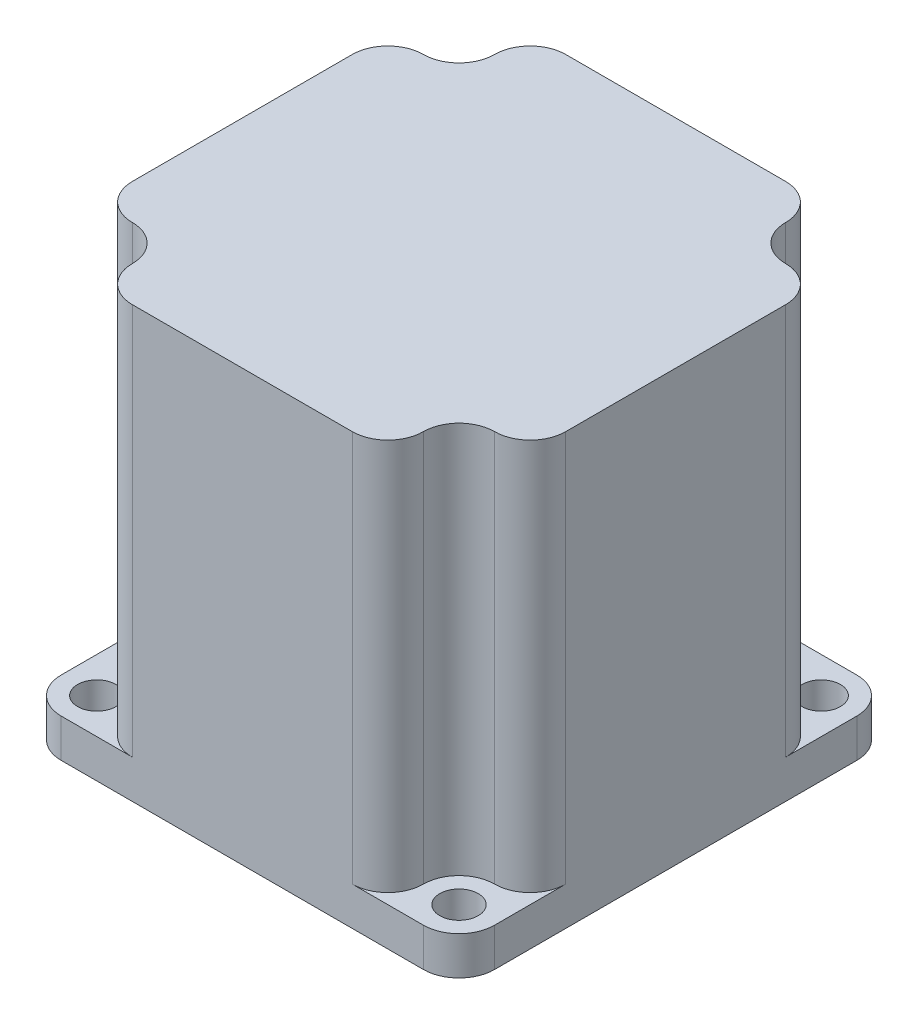
ISO-10303-21;
HEADER;
FILE_DESCRIPTION(('STEP AP214'),'2;1');
FILE_NAME('part.step','',(''),(''),'','','');
FILE_SCHEMA(('AUTOMOTIVE_DESIGN { 1 0 10303 214 1 1 1 1 }'));
ENDSEC;
DATA;
#1=APPLICATION_CONTEXT('core data for automotive mechanical design processes');
#2=APPLICATION_PROTOCOL_DEFINITION('international standard','automotive_design',2000,#1);
#3=PRODUCT_CONTEXT('',#1,'mechanical');
#4=PRODUCT('Part','Part','',(#3));
#5=PRODUCT_RELATED_PRODUCT_CATEGORY('part','',(#4));
#6=PRODUCT_DEFINITION_FORMATION('','',#4);
#7=PRODUCT_DEFINITION_CONTEXT('part definition',#1,'design');
#8=PRODUCT_DEFINITION('design','',#6,#7);
#9=PRODUCT_DEFINITION_SHAPE('','',#8);
#10=(LENGTH_UNIT() NAMED_UNIT(*) SI_UNIT(.MILLI.,.METRE.));
#11=(NAMED_UNIT(*) PLANE_ANGLE_UNIT() SI_UNIT($,.RADIAN.));
#12=(NAMED_UNIT(*) SI_UNIT($,.STERADIAN.) SOLID_ANGLE_UNIT());
#13=UNCERTAINTY_MEASURE_WITH_UNIT(LENGTH_MEASURE(1.E-05),#10,'distance_accuracy_value','');
#14=(GEOMETRIC_REPRESENTATION_CONTEXT(3) GLOBAL_UNCERTAINTY_ASSIGNED_CONTEXT((#13)) GLOBAL_UNIT_ASSIGNED_CONTEXT((#10,
#11,#12)) REPRESENTATION_CONTEXT('',''));
#15=CARTESIAN_POINT('',(0.,0.,0.));
#16=DIRECTION('',(0.,0.,1.));
#17=DIRECTION('',(1.,0.,0.));
#18=AXIS2_PLACEMENT_3D('',#15,#16,#17);
#19=CARTESIAN_POINT('',(23.5699999946438,0.,23.5700000053562));
#20=DIRECTION('',(0.,-1.,0.));
#21=DIRECTION('',(0.,0.,-1.));
#22=AXIS2_PLACEMENT_3D('',#19,#20,#21);
#23=CYLINDRICAL_SURFACE('',#22,2.5);
#24=CARTESIAN_POINT('',(23.5699999946438,0.,23.5700000053562));
#25=DIRECTION('',(0.,-1.,0.));
#26=DIRECTION('',(0.,0.,-1.));
#27=AXIS2_PLACEMENT_3D('',#24,#25,#26);
#28=CIRCLE('',#27,2.5);
#29=CARTESIAN_POINT('',(23.5699999946438,0.,21.0700000053562));
#30=VERTEX_POINT('',#29);
#31=EDGE_CURVE('E491',#30,#30,#28,.T.);
#32=ORIENTED_EDGE('',*,*,#31,.T.);
#33=EDGE_LOOP('',(#32));
#34=FACE_BOUND('',#33,.T.);
#35=CARTESIAN_POINT('',(23.5699999946438,5.,23.5700000053562));
#36=DIRECTION('',(0.,1.,0.));
#37=DIRECTION('',(0.,0.,1.));
#38=AXIS2_PLACEMENT_3D('',#35,#36,#37);
#39=CIRCLE('',#38,2.5);
#40=CARTESIAN_POINT('',(23.5699999946438,5.,26.0700000053562));
#41=VERTEX_POINT('',#40);
#42=EDGE_CURVE('E280',#41,#41,#39,.F.);
#43=ORIENTED_EDGE('',*,*,#42,.F.);
#44=EDGE_LOOP('',(#43));
#45=FACE_BOUND('',#44,.T.);
#46=ADVANCED_FACE('F36',(#34,#45),#23,.F.);
#47=CARTESIAN_POINT('',(-23.5700000053562,0.,23.57));
#48=DIRECTION('',(0.,-1.,0.));
#49=DIRECTION('',(0.,0.,-1.));
#50=AXIS2_PLACEMENT_3D('',#47,#48,#49);
#51=CYLINDRICAL_SURFACE('',#50,2.5);
#52=CARTESIAN_POINT('',(-23.5700000053562,0.,23.57));
#53=DIRECTION('',(0.,-1.,0.));
#54=DIRECTION('',(0.,0.,-1.));
#55=AXIS2_PLACEMENT_3D('',#52,#53,#54);
#56=CIRCLE('',#55,2.5);
#57=CARTESIAN_POINT('',(-23.5700000053562,0.,21.07));
#58=VERTEX_POINT('',#57);
#59=EDGE_CURVE('E488',#58,#58,#56,.T.);
#60=ORIENTED_EDGE('',*,*,#59,.T.);
#61=EDGE_LOOP('',(#60));
#62=FACE_BOUND('',#61,.T.);
#63=CARTESIAN_POINT('',(-23.5700000053562,5.,23.57));
#64=DIRECTION('',(0.,1.,0.));
#65=DIRECTION('',(0.,0.,1.));
#66=AXIS2_PLACEMENT_3D('',#63,#64,#65);
#67=CIRCLE('',#66,2.5);
#68=CARTESIAN_POINT('',(-23.5700000053562,5.,26.07));
#69=VERTEX_POINT('',#68);
#70=EDGE_CURVE('E276',#69,#69,#67,.F.);
#71=ORIENTED_EDGE('',*,*,#70,.F.);
#72=EDGE_LOOP('',(#71));
#73=FACE_BOUND('',#72,.T.);
#74=ADVANCED_FACE('F505',(#62,#73),#51,.F.);
#75=CARTESIAN_POINT('',(23.57,0.,-23.5699999946438));
#76=DIRECTION('',(0.,-1.,0.));
#77=DIRECTION('',(0.,0.,-1.));
#78=AXIS2_PLACEMENT_3D('',#75,#76,#77);
#79=CYLINDRICAL_SURFACE('',#78,2.5);
#80=CARTESIAN_POINT('',(23.57,0.,-23.5699999946438));
#81=DIRECTION('',(0.,-1.,0.));
#82=DIRECTION('',(0.,0.,-1.));
#83=AXIS2_PLACEMENT_3D('',#80,#81,#82);
#84=CIRCLE('',#83,2.5);
#85=CARTESIAN_POINT('',(23.57,0.,-26.0699999946438));
#86=VERTEX_POINT('',#85);
#87=EDGE_CURVE('E271',#86,#86,#84,.T.);
#88=ORIENTED_EDGE('',*,*,#87,.T.);
#89=EDGE_LOOP('',(#88));
#90=FACE_BOUND('',#89,.T.);
#91=CARTESIAN_POINT('',(23.57,5.,-23.5699999946438));
#92=DIRECTION('',(0.,1.,0.));
#93=DIRECTION('',(0.,0.,1.));
#94=AXIS2_PLACEMENT_3D('',#91,#92,#93);
#95=CIRCLE('',#94,2.5);
#96=CARTESIAN_POINT('',(23.57,5.,-21.0699999946438));
#97=VERTEX_POINT('',#96);
#98=EDGE_CURVE('E273',#97,#97,#95,.F.);
#99=ORIENTED_EDGE('',*,*,#98,.F.);
#100=EDGE_LOOP('',(#99));
#101=FACE_BOUND('',#100,.T.);
#102=ADVANCED_FACE('F511',(#90,#101),#79,.F.);
#103=CARTESIAN_POINT('',(-23.57,0.,-23.57));
#104=DIRECTION('',(0.,-1.,0.));
#105=DIRECTION('',(0.,0.,-1.));
#106=AXIS2_PLACEMENT_3D('',#103,#104,#105);
#107=CYLINDRICAL_SURFACE('',#106,2.5);
#108=CARTESIAN_POINT('',(-23.57,0.,-23.57));
#109=DIRECTION('',(0.,-1.,0.));
#110=DIRECTION('',(0.,0.,-1.));
#111=AXIS2_PLACEMENT_3D('',#108,#109,#110);
#112=CIRCLE('',#111,2.5);
#113=CARTESIAN_POINT('',(-23.57,0.,-26.07));
#114=VERTEX_POINT('',#113);
#115=EDGE_CURVE('E485',#114,#114,#112,.T.);
#116=ORIENTED_EDGE('',*,*,#115,.T.);
#117=EDGE_LOOP('',(#116));
#118=FACE_BOUND('',#117,.T.);
#119=CARTESIAN_POINT('',(-23.57,5.,-23.57));
#120=DIRECTION('',(0.,1.,0.));
#121=DIRECTION('',(0.,0.,1.));
#122=AXIS2_PLACEMENT_3D('',#119,#120,#121);
#123=CIRCLE('',#122,2.5);
#124=CARTESIAN_POINT('',(-23.57,5.,-21.07));
#125=VERTEX_POINT('',#124);
#126=EDGE_CURVE('E268',#125,#125,#123,.F.);
#127=ORIENTED_EDGE('',*,*,#126,.F.);
#128=EDGE_LOOP('',(#127));
#129=FACE_BOUND('',#128,.T.);
#130=ADVANCED_FACE('F536',(#118,#129),#107,.F.);
#131=CARTESIAN_POINT('',(-28.2,56.,28.2));
#132=DIRECTION('',(0.,0.,-1.));
#133=DIRECTION('',(-1.,0.,0.));
#134=AXIS2_PLACEMENT_3D('',#131,#132,#133);
#135=PLANE('',#134);
#136=DIRECTION('',(1.,0.,0.));
#137=VECTOR('',#136,1.);
#138=CARTESIAN_POINT('',(-28.2,0.,28.2));
#139=LINE('',#138,#137);
#140=CARTESIAN_POINT('',(-23.57,0.,28.2));
#141=VERTEX_POINT('',#140);
#142=CARTESIAN_POINT('',(23.57,0.,28.2));
#143=VERTEX_POINT('',#142);
#144=EDGE_CURVE('E238',#141,#143,#139,.T.);
#145=ORIENTED_EDGE('',*,*,#144,.T.);
#146=DIRECTION('',(0.,-1.,0.));
#147=VECTOR('',#146,1.);
#148=CARTESIAN_POINT('',(23.57,56.,28.2));
#149=LINE('',#148,#147);
#150=CARTESIAN_POINT('',(23.57,5.,28.2));
#151=VERTEX_POINT('',#150);
#152=EDGE_CURVE('E309',#143,#151,#149,.F.);
#153=ORIENTED_EDGE('',*,*,#152,.T.);
#154=DIRECTION('',(-1.,0.,0.));
#155=VECTOR('',#154,1.);
#156=CARTESIAN_POINT('',(18.94,5.,28.2));
#157=LINE('',#156,#155);
#158=CARTESIAN_POINT('',(14.31,5.,28.2));
#159=VERTEX_POINT('',#158);
#160=EDGE_CURVE('E475',#151,#159,#157,.T.);
#161=ORIENTED_EDGE('',*,*,#160,.T.);
#162=DIRECTION('',(0.,1.,0.));
#163=VECTOR('',#162,1.);
#164=CARTESIAN_POINT('',(14.31,56.,28.2));
#165=LINE('',#164,#163);
#166=CARTESIAN_POINT('',(14.31,56.,28.2));
#167=VERTEX_POINT('',#166);
#168=EDGE_CURVE('E307',#159,#167,#165,.T.);
#169=ORIENTED_EDGE('',*,*,#168,.T.);
#170=DIRECTION('',(1.,0.,0.));
#171=VECTOR('',#170,1.);
#172=CARTESIAN_POINT('',(-28.2,56.,28.2));
#173=LINE('',#172,#171);
#174=CARTESIAN_POINT('',(-14.31,56.,28.2));
#175=VERTEX_POINT('',#174);
#176=EDGE_CURVE('E241',#175,#167,#173,.T.);
#177=ORIENTED_EDGE('',*,*,#176,.F.);
#178=DIRECTION('',(0.,1.,0.));
#179=VECTOR('',#178,1.);
#180=CARTESIAN_POINT('',(-14.31,56.,28.2));
#181=LINE('',#180,#179);
#182=CARTESIAN_POINT('',(-14.31,5.,28.2));
#183=VERTEX_POINT('',#182);
#184=EDGE_CURVE('E304',#175,#183,#181,.F.);
#185=ORIENTED_EDGE('',*,*,#184,.T.);
#186=DIRECTION('',(-1.,0.,0.));
#187=VECTOR('',#186,1.);
#188=CARTESIAN_POINT('',(-28.2,5.,28.2));
#189=LINE('',#188,#187);
#190=CARTESIAN_POINT('',(-23.57,5.,28.2));
#191=VERTEX_POINT('',#190);
#192=EDGE_CURVE('E445',#183,#191,#189,.T.);
#193=ORIENTED_EDGE('',*,*,#192,.T.);
#194=DIRECTION('',(0.,-1.,0.));
#195=VECTOR('',#194,1.);
#196=CARTESIAN_POINT('',(-23.57,56.,28.2));
#197=LINE('',#196,#195);
#198=EDGE_CURVE('E301',#191,#141,#197,.T.);
#199=ORIENTED_EDGE('',*,*,#198,.T.);
#200=EDGE_LOOP('',(#145,#153,#161,#169,#177,#185,#193,#199));
#201=FACE_BOUND('',#200,.T.);
#202=ADVANCED_FACE('F444',(#201),#135,.F.);
#203=CARTESIAN_POINT('',(28.2,56.,28.2));
#204=DIRECTION('',(-1.,0.,0.));
#205=DIRECTION('',(0.,0.,1.));
#206=AXIS2_PLACEMENT_3D('',#203,#204,#205);
#207=PLANE('',#206);
#208=DIRECTION('',(0.,0.,1.));
#209=VECTOR('',#208,1.);
#210=CARTESIAN_POINT('',(28.2,5.,18.94));
#211=LINE('',#210,#209);
#212=CARTESIAN_POINT('',(28.2,5.,14.31));
#213=VERTEX_POINT('',#212);
#214=CARTESIAN_POINT('',(28.2,5.,23.57));
#215=VERTEX_POINT('',#214);
#216=EDGE_CURVE('E396',#213,#215,#211,.T.);
#217=ORIENTED_EDGE('',*,*,#216,.T.);
#218=DIRECTION('',(0.,-1.,0.));
#219=VECTOR('',#218,1.);
#220=CARTESIAN_POINT('',(28.2,56.,23.57));
#221=LINE('',#220,#219);
#222=CARTESIAN_POINT('',(28.2,0.,23.57));
#223=VERTEX_POINT('',#222);
#224=EDGE_CURVE('E290',#215,#223,#221,.T.);
#225=ORIENTED_EDGE('',*,*,#224,.T.);
#226=DIRECTION('',(0.,0.,-1.));
#227=VECTOR('',#226,1.);
#228=CARTESIAN_POINT('',(28.2,0.,28.2));
#229=LINE('',#228,#227);
#230=CARTESIAN_POINT('',(28.2,0.,-23.57));
#231=VERTEX_POINT('',#230);
#232=EDGE_CURVE('E257',#223,#231,#229,.T.);
#233=ORIENTED_EDGE('',*,*,#232,.T.);
#234=DIRECTION('',(0.,-1.,0.));
#235=VECTOR('',#234,1.);
#236=CARTESIAN_POINT('',(28.2,56.,-23.57));
#237=LINE('',#236,#235);
#238=CARTESIAN_POINT('',(28.2,5.,-23.57));
#239=VERTEX_POINT('',#238);
#240=EDGE_CURVE('E288',#231,#239,#237,.F.);
#241=ORIENTED_EDGE('',*,*,#240,.T.);
#242=DIRECTION('',(0.,0.,1.));
#243=VECTOR('',#242,1.);
#244=CARTESIAN_POINT('',(28.2,5.,-18.94));
#245=LINE('',#244,#243);
#246=CARTESIAN_POINT('',(28.2,5.,-14.31));
#247=VERTEX_POINT('',#246);
#248=EDGE_CURVE('E572',#239,#247,#245,.T.);
#249=ORIENTED_EDGE('',*,*,#248,.T.);
#250=DIRECTION('',(0.,1.,0.));
#251=VECTOR('',#250,1.);
#252=CARTESIAN_POINT('',(28.2,56.,-14.31));
#253=LINE('',#252,#251);
#254=CARTESIAN_POINT('',(28.2,56.,-14.31));
#255=VERTEX_POINT('',#254);
#256=EDGE_CURVE('E286',#247,#255,#253,.T.);
#257=ORIENTED_EDGE('',*,*,#256,.T.);
#258=DIRECTION('',(0.,0.,-1.));
#259=VECTOR('',#258,1.);
#260=CARTESIAN_POINT('',(28.2,56.,28.2));
#261=LINE('',#260,#259);
#262=CARTESIAN_POINT('',(28.2,56.,14.31));
#263=VERTEX_POINT('',#262);
#264=EDGE_CURVE('E244',#263,#255,#261,.T.);
#265=ORIENTED_EDGE('',*,*,#264,.F.);
#266=DIRECTION('',(0.,1.,0.));
#267=VECTOR('',#266,1.);
#268=CARTESIAN_POINT('',(28.2,56.,14.31));
#269=LINE('',#268,#267);
#270=EDGE_CURVE('E267',#263,#213,#269,.F.);
#271=ORIENTED_EDGE('',*,*,#270,.T.);
#272=EDGE_LOOP('',(#217,#225,#233,#241,#249,#257,#265,#271));
#273=FACE_BOUND('',#272,.T.);
#274=ADVANCED_FACE('F465',(#273),#207,.F.);
#275=CARTESIAN_POINT('',(28.2,56.,-28.2));
#276=DIRECTION('',(0.,0.,1.));
#277=DIRECTION('',(1.,0.,0.));
#278=AXIS2_PLACEMENT_3D('',#275,#276,#277);
#279=PLANE('',#278);
#280=DIRECTION('',(1.,0.,0.));
#281=VECTOR('',#280,1.);
#282=CARTESIAN_POINT('',(18.94,5.,-28.2));
#283=LINE('',#282,#281);
#284=CARTESIAN_POINT('',(14.31,5.,-28.2));
#285=VERTEX_POINT('',#284);
#286=CARTESIAN_POINT('',(23.57,5.,-28.2));
#287=VERTEX_POINT('',#286);
#288=EDGE_CURVE('E277',#285,#287,#283,.T.);
#289=ORIENTED_EDGE('',*,*,#288,.T.);
#290=DIRECTION('',(0.,-1.,0.));
#291=VECTOR('',#290,1.);
#292=CARTESIAN_POINT('',(23.57,56.,-28.2));
#293=LINE('',#292,#291);
#294=CARTESIAN_POINT('',(23.57,0.,-28.2));
#295=VERTEX_POINT('',#294);
#296=EDGE_CURVE('E323',#287,#295,#293,.T.);
#297=ORIENTED_EDGE('',*,*,#296,.T.);
#298=DIRECTION('',(-1.,0.,0.));
#299=VECTOR('',#298,1.);
#300=CARTESIAN_POINT('',(28.2,0.,-28.2));
#301=LINE('',#300,#299);
#302=CARTESIAN_POINT('',(-23.57,0.,-28.2));
#303=VERTEX_POINT('',#302);
#304=EDGE_CURVE('E260',#295,#303,#301,.T.);
#305=ORIENTED_EDGE('',*,*,#304,.T.);
#306=DIRECTION('',(0.,-1.,0.));
#307=VECTOR('',#306,1.);
#308=CARTESIAN_POINT('',(-23.57,56.,-28.2));
#309=LINE('',#308,#307);
#310=CARTESIAN_POINT('',(-23.57,5.,-28.2));
#311=VERTEX_POINT('',#310);
#312=EDGE_CURVE('E315',#303,#311,#309,.F.);
#313=ORIENTED_EDGE('',*,*,#312,.T.);
#314=DIRECTION('',(1.,0.,0.));
#315=VECTOR('',#314,1.);
#316=CARTESIAN_POINT('',(-28.2,5.,-28.2));
#317=LINE('',#316,#315);
#318=CARTESIAN_POINT('',(-14.31,5.,-28.2));
#319=VERTEX_POINT('',#318);
#320=EDGE_CURVE('E283',#311,#319,#317,.T.);
#321=ORIENTED_EDGE('',*,*,#320,.T.);
#322=DIRECTION('',(0.,1.,0.));
#323=VECTOR('',#322,1.);
#324=CARTESIAN_POINT('',(-14.31,56.,-28.2));
#325=LINE('',#324,#323);
#326=CARTESIAN_POINT('',(-14.31,56.,-28.2));
#327=VERTEX_POINT('',#326);
#328=EDGE_CURVE('E317',#319,#327,#325,.T.);
#329=ORIENTED_EDGE('',*,*,#328,.T.);
#330=DIRECTION('',(-1.,0.,0.));
#331=VECTOR('',#330,1.);
#332=CARTESIAN_POINT('',(28.2,56.,-28.2));
#333=LINE('',#332,#331);
#334=CARTESIAN_POINT('',(14.31,56.,-28.2));
#335=VERTEX_POINT('',#334);
#336=EDGE_CURVE('E248',#335,#327,#333,.T.);
#337=ORIENTED_EDGE('',*,*,#336,.F.);
#338=DIRECTION('',(0.,1.,0.));
#339=VECTOR('',#338,1.);
#340=CARTESIAN_POINT('',(14.31,56.,-28.2));
#341=LINE('',#340,#339);
#342=EDGE_CURVE('E320',#335,#285,#341,.F.);
#343=ORIENTED_EDGE('',*,*,#342,.T.);
#344=EDGE_LOOP('',(#289,#297,#305,#313,#321,#329,#337,#343));
#345=FACE_BOUND('',#344,.T.);
#346=ADVANCED_FACE('F574',(#345),#279,.F.);
#347=CARTESIAN_POINT('',(-28.2,56.,-28.2));
#348=DIRECTION('',(1.,0.,0.));
#349=DIRECTION('',(0.,0.,-1.));
#350=AXIS2_PLACEMENT_3D('',#347,#348,#349);
#351=PLANE('',#350);
#352=DIRECTION('',(0.,0.,1.));
#353=VECTOR('',#352,1.);
#354=CARTESIAN_POINT('',(-28.2,0.,-28.2));
#355=LINE('',#354,#353);
#356=CARTESIAN_POINT('',(-28.2,0.,-23.57));
#357=VERTEX_POINT('',#356);
#358=CARTESIAN_POINT('',(-28.2,0.,23.57));
#359=VERTEX_POINT('',#358);
#360=EDGE_CURVE('E245',#357,#359,#355,.T.);
#361=ORIENTED_EDGE('',*,*,#360,.T.);
#362=DIRECTION('',(0.,-1.,0.));
#363=VECTOR('',#362,1.);
#364=CARTESIAN_POINT('',(-28.2,56.,23.57));
#365=LINE('',#364,#363);
#366=CARTESIAN_POINT('',(-28.2,5.,23.57));
#367=VERTEX_POINT('',#366);
#368=EDGE_CURVE('E358',#359,#367,#365,.F.);
#369=ORIENTED_EDGE('',*,*,#368,.T.);
#370=DIRECTION('',(0.,0.,-1.));
#371=VECTOR('',#370,1.);
#372=CARTESIAN_POINT('',(-28.2,5.,28.2));
#373=LINE('',#372,#371);
#374=CARTESIAN_POINT('',(-28.2,5.,14.31));
#375=VERTEX_POINT('',#374);
#376=EDGE_CURVE('E426',#367,#375,#373,.T.);
#377=ORIENTED_EDGE('',*,*,#376,.T.);
#378=DIRECTION('',(0.,1.,0.));
#379=VECTOR('',#378,1.);
#380=CARTESIAN_POINT('',(-28.2,56.,14.31));
#381=LINE('',#380,#379);
#382=CARTESIAN_POINT('',(-28.2,56.,14.31));
#383=VERTEX_POINT('',#382);
#384=EDGE_CURVE('E356',#375,#383,#381,.T.);
#385=ORIENTED_EDGE('',*,*,#384,.T.);
#386=DIRECTION('',(0.,0.,1.));
#387=VECTOR('',#386,1.);
#388=CARTESIAN_POINT('',(-28.2,56.,-28.2));
#389=LINE('',#388,#387);
#390=CARTESIAN_POINT('',(-28.2,56.,-14.31));
#391=VERTEX_POINT('',#390);
#392=EDGE_CURVE('E251',#391,#383,#389,.T.);
#393=ORIENTED_EDGE('',*,*,#392,.F.);
#394=DIRECTION('',(0.,1.,0.));
#395=VECTOR('',#394,1.);
#396=CARTESIAN_POINT('',(-28.2,56.,-14.31));
#397=LINE('',#396,#395);
#398=CARTESIAN_POINT('',(-28.2,5.,-14.31));
#399=VERTEX_POINT('',#398);
#400=EDGE_CURVE('E353',#391,#399,#397,.F.);
#401=ORIENTED_EDGE('',*,*,#400,.T.);
#402=DIRECTION('',(0.,0.,-1.));
#403=VECTOR('',#402,1.);
#404=CARTESIAN_POINT('',(-28.2,5.,-28.2));
#405=LINE('',#404,#403);
#406=CARTESIAN_POINT('',(-28.2,5.,-23.57));
#407=VERTEX_POINT('',#406);
#408=EDGE_CURVE('E272',#399,#407,#405,.T.);
#409=ORIENTED_EDGE('',*,*,#408,.T.);
#410=DIRECTION('',(0.,-1.,0.));
#411=VECTOR('',#410,1.);
#412=CARTESIAN_POINT('',(-28.2,56.,-23.57));
#413=LINE('',#412,#411);
#414=EDGE_CURVE('E350',#407,#357,#413,.T.);
#415=ORIENTED_EDGE('',*,*,#414,.T.);
#416=EDGE_LOOP('',(#361,#369,#377,#385,#393,#401,#409,#415));
#417=FACE_BOUND('',#416,.T.);
#418=ADVANCED_FACE('F422',(#417),#351,.F.);
#419=CARTESIAN_POINT('',(0.,56.,0.));
#420=DIRECTION('',(0.,1.,0.));
#421=DIRECTION('',(0.,0.,1.));
#422=AXIS2_PLACEMENT_3D('',#419,#420,#421);
#423=PLANE('',#422);
#424=CARTESIAN_POINT('',(23.57,56.,-14.31));
#425=DIRECTION('',(0.,1.,0.));
#426=DIRECTION('',(0.,0.,1.));
#427=AXIS2_PLACEMENT_3D('',#424,#425,#426);
#428=CIRCLE('',#427,4.63);
#429=CARTESIAN_POINT('',(23.57,56.,-18.94));
#430=VERTEX_POINT('',#429);
#431=EDGE_CURVE('E342',#255,#430,#428,.T.);
#432=ORIENTED_EDGE('',*,*,#431,.T.);
#433=CARTESIAN_POINT('',(23.57,56.,-23.57));
#434=DIRECTION('',(0.,1.,0.));
#435=DIRECTION('',(0.,0.,1.));
#436=AXIS2_PLACEMENT_3D('',#433,#434,#435);
#437=CIRCLE('',#436,4.63);
#438=CARTESIAN_POINT('',(18.94,56.,-23.57));
#439=VERTEX_POINT('',#438);
#440=EDGE_CURVE('E368',#430,#439,#437,.F.);
#441=ORIENTED_EDGE('',*,*,#440,.T.);
#442=CARTESIAN_POINT('',(14.31,56.,-23.57));
#443=DIRECTION('',(0.,1.,0.));
#444=DIRECTION('',(0.,0.,1.));
#445=AXIS2_PLACEMENT_3D('',#442,#443,#444);
#446=CIRCLE('',#445,4.63);
#447=EDGE_CURVE('E344',#439,#335,#446,.T.);
#448=ORIENTED_EDGE('',*,*,#447,.T.);
#449=ORIENTED_EDGE('',*,*,#336,.T.);
#450=CARTESIAN_POINT('',(-14.31,56.,-23.57));
#451=DIRECTION('',(0.,1.,0.));
#452=DIRECTION('',(0.,0.,1.));
#453=AXIS2_PLACEMENT_3D('',#450,#451,#452);
#454=CIRCLE('',#453,4.63);
#455=CARTESIAN_POINT('',(-18.94,56.,-23.57));
#456=VERTEX_POINT('',#455);
#457=EDGE_CURVE('E332',#327,#456,#454,.T.);
#458=ORIENTED_EDGE('',*,*,#457,.T.);
#459=CARTESIAN_POINT('',(-23.57,56.,-23.57));
#460=DIRECTION('',(0.,1.,0.));
#461=DIRECTION('',(0.,0.,1.));
#462=AXIS2_PLACEMENT_3D('',#459,#460,#461);
#463=CIRCLE('',#462,4.63);
#464=CARTESIAN_POINT('',(-23.57,56.,-18.94));
#465=VERTEX_POINT('',#464);
#466=EDGE_CURVE('E12',#456,#465,#463,.F.);
#467=ORIENTED_EDGE('',*,*,#466,.T.);
#468=CARTESIAN_POINT('',(-23.57,56.,-14.31));
#469=DIRECTION('',(0.,1.,0.));
#470=DIRECTION('',(0.,0.,1.));
#471=AXIS2_PLACEMENT_3D('',#468,#469,#470);
#472=CIRCLE('',#471,4.63);
#473=EDGE_CURVE('E330',#465,#391,#472,.T.);
#474=ORIENTED_EDGE('',*,*,#473,.T.);
#475=ORIENTED_EDGE('',*,*,#392,.T.);
#476=CARTESIAN_POINT('',(-23.57,56.,14.31));
#477=DIRECTION('',(0.,1.,0.));
#478=DIRECTION('',(0.,0.,1.));
#479=AXIS2_PLACEMENT_3D('',#476,#477,#478);
#480=CIRCLE('',#479,4.63);
#481=CARTESIAN_POINT('',(-23.57,56.,18.94));
#482=VERTEX_POINT('',#481);
#483=EDGE_CURVE('E334',#383,#482,#480,.T.);
#484=ORIENTED_EDGE('',*,*,#483,.T.);
#485=CARTESIAN_POINT('',(-23.57,56.,23.57));
#486=DIRECTION('',(0.,1.,0.));
#487=DIRECTION('',(0.,0.,1.));
#488=AXIS2_PLACEMENT_3D('',#485,#486,#487);
#489=CIRCLE('',#488,4.63);
#490=CARTESIAN_POINT('',(-18.94,56.,23.57));
#491=VERTEX_POINT('',#490);
#492=EDGE_CURVE('E378',#482,#491,#489,.F.);
#493=ORIENTED_EDGE('',*,*,#492,.T.);
#494=CARTESIAN_POINT('',(-14.31,56.,23.57));
#495=DIRECTION('',(0.,1.,0.));
#496=DIRECTION('',(0.,0.,1.));
#497=AXIS2_PLACEMENT_3D('',#494,#495,#496);
#498=CIRCLE('',#497,4.63);
#499=EDGE_CURVE('E336',#491,#175,#498,.T.);
#500=ORIENTED_EDGE('',*,*,#499,.T.);
#501=ORIENTED_EDGE('',*,*,#176,.T.);
#502=CARTESIAN_POINT('',(14.31,56.,23.57));
#503=DIRECTION('',(0.,1.,0.));
#504=DIRECTION('',(0.,0.,1.));
#505=AXIS2_PLACEMENT_3D('',#502,#503,#504);
#506=CIRCLE('',#505,4.63);
#507=CARTESIAN_POINT('',(18.94,56.,23.57));
#508=VERTEX_POINT('',#507);
#509=EDGE_CURVE('E340',#167,#508,#506,.T.);
#510=ORIENTED_EDGE('',*,*,#509,.T.);
#511=CARTESIAN_POINT('',(23.57,56.,23.57));
#512=DIRECTION('',(0.,1.,0.));
#513=DIRECTION('',(0.,0.,1.));
#514=AXIS2_PLACEMENT_3D('',#511,#512,#513);
#515=CIRCLE('',#514,4.63);
#516=CARTESIAN_POINT('',(23.57,56.,18.94));
#517=VERTEX_POINT('',#516);
#518=EDGE_CURVE('E370',#508,#517,#515,.F.);
#519=ORIENTED_EDGE('',*,*,#518,.T.);
#520=CARTESIAN_POINT('',(23.57,56.,14.31));
#521=DIRECTION('',(0.,1.,0.));
#522=DIRECTION('',(0.,0.,1.));
#523=AXIS2_PLACEMENT_3D('',#520,#521,#522);
#524=CIRCLE('',#523,4.63);
#525=EDGE_CURVE('E338',#517,#263,#524,.T.);
#526=ORIENTED_EDGE('',*,*,#525,.T.);
#527=ORIENTED_EDGE('',*,*,#264,.T.);
#528=EDGE_LOOP('',(#432,#441,#448,#449,#458,#467,#474,#475,#484,#493,#500,#501,#510,#519,#526,#527));
#529=FACE_BOUND('',#528,.T.);
#530=ADVANCED_FACE('F419',(#529),#423,.T.);
#531=CARTESIAN_POINT('',(0.,0.,0.));
#532=DIRECTION('',(0.,1.,0.));
#533=DIRECTION('',(0.,0.,1.));
#534=AXIS2_PLACEMENT_3D('',#531,#532,#533);
#535=PLANE('',#534);
#536=ORIENTED_EDGE('',*,*,#87,.F.);
#537=EDGE_LOOP('',(#536));
#538=FACE_BOUND('',#537,.T.);
#539=ORIENTED_EDGE('',*,*,#115,.F.);
#540=EDGE_LOOP('',(#539));
#541=FACE_BOUND('',#540,.T.);
#542=ORIENTED_EDGE('',*,*,#59,.F.);
#543=EDGE_LOOP('',(#542));
#544=FACE_BOUND('',#543,.T.);
#545=ORIENTED_EDGE('',*,*,#31,.F.);
#546=EDGE_LOOP('',(#545));
#547=FACE_BOUND('',#546,.T.);
#548=CARTESIAN_POINT('',(0.,0.,0.));
#549=DIRECTION('',(0.,1.,0.));
#550=DIRECTION('',(0.,0.,1.));
#551=AXIS2_PLACEMENT_3D('',#548,#549,#550);
#552=CIRCLE('',#551,19.05);
#553=CARTESIAN_POINT('',(0.,0.,19.05));
#554=VERTEX_POINT('',#553);
#555=EDGE_CURVE('E234',#554,#554,#552,.T.);
#556=ORIENTED_EDGE('',*,*,#555,.T.);
#557=EDGE_LOOP('',(#556));
#558=FACE_BOUND('',#557,.T.);
#559=ORIENTED_EDGE('',*,*,#232,.F.);
#560=CARTESIAN_POINT('',(23.57,0.,23.57));
#561=DIRECTION('',(0.,1.,0.));
#562=DIRECTION('',(0.,0.,1.));
#563=AXIS2_PLACEMENT_3D('',#560,#561,#562);
#564=CIRCLE('',#563,4.63);
#565=EDGE_CURVE('E299',#223,#143,#564,.F.);
#566=ORIENTED_EDGE('',*,*,#565,.T.);
#567=ORIENTED_EDGE('',*,*,#144,.F.);
#568=CARTESIAN_POINT('',(-23.57,0.,23.57));
#569=DIRECTION('',(0.,1.,0.));
#570=DIRECTION('',(0.,0.,1.));
#571=AXIS2_PLACEMENT_3D('',#568,#569,#570);
#572=CIRCLE('',#571,4.63);
#573=EDGE_CURVE('E295',#141,#359,#572,.F.);
#574=ORIENTED_EDGE('',*,*,#573,.T.);
#575=ORIENTED_EDGE('',*,*,#360,.F.);
#576=CARTESIAN_POINT('',(-23.57,0.,-23.57));
#577=DIRECTION('',(0.,1.,0.));
#578=DIRECTION('',(0.,0.,1.));
#579=AXIS2_PLACEMENT_3D('',#576,#577,#578);
#580=CIRCLE('',#579,4.63);
#581=EDGE_CURVE('E293',#357,#303,#580,.F.);
#582=ORIENTED_EDGE('',*,*,#581,.T.);
#583=ORIENTED_EDGE('',*,*,#304,.F.);
#584=CARTESIAN_POINT('',(23.57,0.,-23.57));
#585=DIRECTION('',(0.,1.,0.));
#586=DIRECTION('',(0.,0.,1.));
#587=AXIS2_PLACEMENT_3D('',#584,#585,#586);
#588=CIRCLE('',#587,4.63);
#589=EDGE_CURVE('E297',#295,#231,#588,.F.);
#590=ORIENTED_EDGE('',*,*,#589,.T.);
#591=EDGE_LOOP('',(#559,#566,#567,#574,#575,#582,#583,#590));
#592=FACE_BOUND('',#591,.T.);
#593=ADVANCED_FACE('F548',(#538,#541,#544,#547,#558,#592),#535,.F.);
#594=CARTESIAN_POINT('',(0.,-1.6,0.));
#595=DIRECTION('',(0.,1.,0.));
#596=DIRECTION('',(0.,0.,1.));
#597=AXIS2_PLACEMENT_3D('',#594,#595,#596);
#598=CYLINDRICAL_SURFACE('',#597,19.05);
#599=CARTESIAN_POINT('',(0.,-1.6,0.));
#600=DIRECTION('',(0.,1.,0.));
#601=DIRECTION('',(0.,0.,1.));
#602=AXIS2_PLACEMENT_3D('',#599,#600,#601);
#603=CIRCLE('',#602,19.05);
#604=CARTESIAN_POINT('',(0.,-1.6,19.05));
#605=VERTEX_POINT('',#604);
#606=EDGE_CURVE('E235',#605,#605,#603,.T.);
#607=ORIENTED_EDGE('',*,*,#606,.T.);
#608=EDGE_LOOP('',(#607));
#609=FACE_BOUND('',#608,.T.);
#610=ORIENTED_EDGE('',*,*,#555,.F.);
#611=EDGE_LOOP('',(#610));
#612=FACE_BOUND('',#611,.T.);
#613=ADVANCED_FACE('F551',(#609,#612),#598,.T.);
#614=CARTESIAN_POINT('',(0.,-1.6,0.));
#615=DIRECTION('',(0.,1.,0.));
#616=DIRECTION('',(0.,0.,1.));
#617=AXIS2_PLACEMENT_3D('',#614,#615,#616);
#618=PLANE('',#617);
#619=CARTESIAN_POINT('',(0.,-1.6,0.));
#620=DIRECTION('',(0.,1.,0.));
#621=DIRECTION('',(0.,0.,1.));
#622=AXIS2_PLACEMENT_3D('',#619,#620,#621);
#623=CIRCLE('',#622,3.175);
#624=CARTESIAN_POINT('',(0.,-1.6,3.175));
#625=VERTEX_POINT('',#624);
#626=EDGE_CURVE('E254',#625,#625,#623,.F.);
#627=ORIENTED_EDGE('',*,*,#626,.F.);
#628=EDGE_LOOP('',(#627));
#629=FACE_BOUND('',#628,.T.);
#630=ORIENTED_EDGE('',*,*,#606,.F.);
#631=EDGE_LOOP('',(#630));
#632=FACE_BOUND('',#631,.T.);
#633=ADVANCED_FACE('F502',(#629,#632),#618,.F.);
#634=CARTESIAN_POINT('',(0.,-21.,0.));
#635=DIRECTION('',(0.,1.,0.));
#636=DIRECTION('',(0.,0.,1.));
#637=AXIS2_PLACEMENT_3D('',#634,#635,#636);
#638=CYLINDRICAL_SURFACE('',#637,3.175);
#639=CARTESIAN_POINT('',(0.,-21.,0.));
#640=DIRECTION('',(0.,-1.,0.));
#641=DIRECTION('',(0.,0.,-1.));
#642=AXIS2_PLACEMENT_3D('',#639,#640,#641);
#643=CIRCLE('',#642,3.175);
#644=CARTESIAN_POINT('',(-1.78605710994918,-21.,2.625));
#645=VERTEX_POINT('',#644);
#646=CARTESIAN_POINT('',(1.78605710994918,-21.,2.625));
#647=VERTEX_POINT('',#646);
#648=EDGE_CURVE('E228',#645,#647,#643,.T.);
#649=ORIENTED_EDGE('',*,*,#648,.F.);
#650=DIRECTION('',(0.,-1.,0.));
#651=VECTOR('',#650,1.);
#652=CARTESIAN_POINT('',(-1.78605710994918,-5.,2.625));
#653=LINE('',#652,#651);
#654=CARTESIAN_POINT('',(-1.78605710994918,-5.,2.625));
#655=VERTEX_POINT('',#654);
#656=EDGE_CURVE('E220',#655,#645,#653,.T.);
#657=ORIENTED_EDGE('',*,*,#656,.F.);
#658=CARTESIAN_POINT('',(0.,-5.,0.));
#659=DIRECTION('',(0.,-1.,0.));
#660=DIRECTION('',(0.,0.,-1.));
#661=AXIS2_PLACEMENT_3D('',#658,#659,#660);
#662=CIRCLE('',#661,3.175);
#663=CARTESIAN_POINT('',(1.78605710994918,-5.,2.625));
#664=VERTEX_POINT('',#663);
#665=EDGE_CURVE('E209',#664,#655,#662,.T.);
#666=ORIENTED_EDGE('',*,*,#665,.F.);
#667=DIRECTION('',(0.,-1.,0.));
#668=VECTOR('',#667,1.);
#669=CARTESIAN_POINT('',(1.78605710994918,-5.,2.625));
#670=LINE('',#669,#668);
#671=EDGE_CURVE('E222',#664,#647,#670,.T.);
#672=ORIENTED_EDGE('',*,*,#671,.T.);
#673=EDGE_LOOP('',(#649,#657,#666,#672));
#674=FACE_BOUND('',#673,.T.);
#675=ORIENTED_EDGE('',*,*,#626,.T.);
#676=EDGE_LOOP('',(#675));
#677=FACE_BOUND('',#676,.T.);
#678=ADVANCED_FACE('F225',(#674,#677),#638,.T.);
#679=CARTESIAN_POINT('',(0.,-21.,0.));
#680=DIRECTION('',(0.,-1.,0.));
#681=DIRECTION('',(0.,0.,-1.));
#682=AXIS2_PLACEMENT_3D('',#679,#680,#681);
#683=PLANE('',#682);
#684=DIRECTION('',(1.,0.,0.));
#685=VECTOR('',#684,1.);
#686=CARTESIAN_POINT('',(-1.78605710994918,-21.,2.625));
#687=LINE('',#686,#685);
#688=EDGE_CURVE('E216',#645,#647,#687,.T.);
#689=ORIENTED_EDGE('',*,*,#688,.F.);
#690=ORIENTED_EDGE('',*,*,#648,.T.);
#691=EDGE_LOOP('',(#689,#690));
#692=FACE_BOUND('',#691,.T.);
#693=ADVANCED_FACE('F494',(#692),#683,.T.);
#694=CARTESIAN_POINT('',(-1.78605710994918,-5.,2.625));
#695=DIRECTION('',(0.,0.,-1.));
#696=DIRECTION('',(-1.,0.,0.));
#697=AXIS2_PLACEMENT_3D('',#694,#695,#696);
#698=PLANE('',#697);
#699=ORIENTED_EDGE('',*,*,#688,.T.);
#700=ORIENTED_EDGE('',*,*,#671,.F.);
#701=DIRECTION('',(1.,0.,0.));
#702=VECTOR('',#701,1.);
#703=CARTESIAN_POINT('',(-1.78605710994918,-5.,2.625));
#704=LINE('',#703,#702);
#705=EDGE_CURVE('E212',#655,#664,#704,.T.);
#706=ORIENTED_EDGE('',*,*,#705,.F.);
#707=ORIENTED_EDGE('',*,*,#656,.T.);
#708=EDGE_LOOP('',(#699,#700,#706,#707));
#709=FACE_BOUND('',#708,.T.);
#710=ADVANCED_FACE('F219',(#709),#698,.F.);
#711=CARTESIAN_POINT('',(0.,-5.,0.));
#712=DIRECTION('',(0.,-1.,0.));
#713=DIRECTION('',(0.,0.,-1.));
#714=AXIS2_PLACEMENT_3D('',#711,#712,#713);
#715=PLANE('',#714);
#716=ORIENTED_EDGE('',*,*,#665,.T.);
#717=ORIENTED_EDGE('',*,*,#705,.T.);
#718=EDGE_LOOP('',(#716,#717));
#719=FACE_BOUND('',#718,.T.);
#720=ADVANCED_FACE('F211',(#719),#715,.T.);
#721=CARTESIAN_POINT('',(0.,5.,0.));
#722=DIRECTION('',(0.,1.,0.));
#723=DIRECTION('',(0.,0.,1.));
#724=AXIS2_PLACEMENT_3D('',#721,#722,#723);
#725=PLANE('',#724);
#726=ORIENTED_EDGE('',*,*,#320,.F.);
#727=CARTESIAN_POINT('',(-23.57,5.,-23.57));
#728=DIRECTION('',(0.,1.,0.));
#729=DIRECTION('',(0.,0.,1.));
#730=AXIS2_PLACEMENT_3D('',#727,#728,#729);
#731=CIRCLE('',#730,4.63);
#732=EDGE_CURVE('E361',#311,#407,#731,.T.);
#733=ORIENTED_EDGE('',*,*,#732,.T.);
#734=ORIENTED_EDGE('',*,*,#408,.F.);
#735=CARTESIAN_POINT('',(-23.57,5.,-14.31));
#736=DIRECTION('',(0.,1.,0.));
#737=DIRECTION('',(0.,0.,1.));
#738=AXIS2_PLACEMENT_3D('',#735,#736,#737);
#739=CIRCLE('',#738,4.63);
#740=CARTESIAN_POINT('',(-23.57,5.,-18.94));
#741=VERTEX_POINT('',#740);
#742=EDGE_CURVE('E45',#399,#741,#739,.F.);
#743=ORIENTED_EDGE('',*,*,#742,.T.);
#744=CARTESIAN_POINT('',(-23.57,5.,-23.57));
#745=DIRECTION('',(0.,1.,0.));
#746=DIRECTION('',(0.,0.,1.));
#747=AXIS2_PLACEMENT_3D('',#744,#745,#746);
#748=CIRCLE('',#747,4.63);
#749=CARTESIAN_POINT('',(-18.94,5.,-23.57));
#750=VERTEX_POINT('',#749);
#751=EDGE_CURVE('E53',#741,#750,#748,.T.);
#752=ORIENTED_EDGE('',*,*,#751,.T.);
#753=CARTESIAN_POINT('',(-14.31,5.,-23.57));
#754=DIRECTION('',(0.,1.,0.));
#755=DIRECTION('',(0.,0.,1.));
#756=AXIS2_PLACEMENT_3D('',#753,#754,#755);
#757=CIRCLE('',#756,4.63);
#758=EDGE_CURVE('E386',#750,#319,#757,.F.);
#759=ORIENTED_EDGE('',*,*,#758,.T.);
#760=EDGE_LOOP('',(#726,#733,#734,#743,#752,#759));
#761=FACE_BOUND('',#760,.T.);
#762=ORIENTED_EDGE('',*,*,#126,.T.);
#763=EDGE_LOOP('',(#762));
#764=FACE_BOUND('',#763,.T.);
#765=ADVANCED_FACE('F518',(#761,#764),#725,.T.);
#766=CARTESIAN_POINT('',(0.,5.,0.));
#767=DIRECTION('',(0.,1.,0.));
#768=DIRECTION('',(0.,0.,1.));
#769=AXIS2_PLACEMENT_3D('',#766,#767,#768);
#770=PLANE('',#769);
#771=ORIENTED_EDGE('',*,*,#248,.F.);
#772=CARTESIAN_POINT('',(23.57,5.,-23.57));
#773=DIRECTION('',(0.,1.,0.));
#774=DIRECTION('',(0.,0.,1.));
#775=AXIS2_PLACEMENT_3D('',#772,#773,#774);
#776=CIRCLE('',#775,4.63);
#777=EDGE_CURVE('E328',#239,#287,#776,.T.);
#778=ORIENTED_EDGE('',*,*,#777,.T.);
#779=ORIENTED_EDGE('',*,*,#288,.F.);
#780=CARTESIAN_POINT('',(14.31,5.,-23.57));
#781=DIRECTION('',(0.,1.,0.));
#782=DIRECTION('',(0.,0.,1.));
#783=AXIS2_PLACEMENT_3D('',#780,#781,#782);
#784=CIRCLE('',#783,4.63);
#785=CARTESIAN_POINT('',(18.94,5.,-23.57));
#786=VERTEX_POINT('',#785);
#787=EDGE_CURVE('E363',#285,#786,#784,.F.);
#788=ORIENTED_EDGE('',*,*,#787,.T.);
#789=CARTESIAN_POINT('',(23.57,5.,-23.57));
#790=DIRECTION('',(0.,1.,0.));
#791=DIRECTION('',(0.,0.,1.));
#792=AXIS2_PLACEMENT_3D('',#789,#790,#791);
#793=CIRCLE('',#792,4.63);
#794=CARTESIAN_POINT('',(23.57,5.,-18.94));
#795=VERTEX_POINT('',#794);
#796=EDGE_CURVE('E326',#786,#795,#793,.T.);
#797=ORIENTED_EDGE('',*,*,#796,.T.);
#798=CARTESIAN_POINT('',(23.57,5.,-14.31));
#799=DIRECTION('',(0.,1.,0.));
#800=DIRECTION('',(0.,0.,1.));
#801=AXIS2_PLACEMENT_3D('',#798,#799,#800);
#802=CIRCLE('',#801,4.63);
#803=EDGE_CURVE('E365',#795,#247,#802,.F.);
#804=ORIENTED_EDGE('',*,*,#803,.T.);
#805=EDGE_LOOP('',(#771,#778,#779,#788,#797,#804));
#806=FACE_BOUND('',#805,.T.);
#807=ORIENTED_EDGE('',*,*,#98,.T.);
#808=EDGE_LOOP('',(#807));
#809=FACE_BOUND('',#808,.T.);
#810=ADVANCED_FACE('F522',(#806,#809),#770,.T.);
#811=CARTESIAN_POINT('',(0.,5.,0.));
#812=DIRECTION('',(0.,1.,0.));
#813=DIRECTION('',(0.,0.,1.));
#814=AXIS2_PLACEMENT_3D('',#811,#812,#813);
#815=PLANE('',#814);
#816=ORIENTED_EDGE('',*,*,#192,.F.);
#817=CARTESIAN_POINT('',(-14.31,5.,23.57));
#818=DIRECTION('',(0.,1.,0.));
#819=DIRECTION('',(0.,0.,1.));
#820=AXIS2_PLACEMENT_3D('',#817,#818,#819);
#821=CIRCLE('',#820,4.63);
#822=CARTESIAN_POINT('',(-18.94,5.,23.57));
#823=VERTEX_POINT('',#822);
#824=EDGE_CURVE('E381',#183,#823,#821,.F.);
#825=ORIENTED_EDGE('',*,*,#824,.T.);
#826=CARTESIAN_POINT('',(-23.57,5.,23.57));
#827=DIRECTION('',(0.,1.,0.));
#828=DIRECTION('',(0.,0.,1.));
#829=AXIS2_PLACEMENT_3D('',#826,#827,#828);
#830=CIRCLE('',#829,4.63);
#831=CARTESIAN_POINT('',(-23.57,5.,18.94));
#832=VERTEX_POINT('',#831);
#833=EDGE_CURVE('E348',#823,#832,#830,.T.);
#834=ORIENTED_EDGE('',*,*,#833,.T.);
#835=CARTESIAN_POINT('',(-23.57,5.,14.31));
#836=DIRECTION('',(0.,1.,0.));
#837=DIRECTION('',(0.,0.,1.));
#838=AXIS2_PLACEMENT_3D('',#835,#836,#837);
#839=CIRCLE('',#838,4.63);
#840=EDGE_CURVE('E383',#832,#375,#839,.F.);
#841=ORIENTED_EDGE('',*,*,#840,.T.);
#842=ORIENTED_EDGE('',*,*,#376,.F.);
#843=CARTESIAN_POINT('',(-23.57,5.,23.57));
#844=DIRECTION('',(0.,1.,0.));
#845=DIRECTION('',(0.,0.,1.));
#846=AXIS2_PLACEMENT_3D('',#843,#844,#845);
#847=CIRCLE('',#846,4.63);
#848=EDGE_CURVE('E346',#367,#191,#847,.T.);
#849=ORIENTED_EDGE('',*,*,#848,.T.);
#850=EDGE_LOOP('',(#816,#825,#834,#841,#842,#849));
#851=FACE_BOUND('',#850,.T.);
#852=ORIENTED_EDGE('',*,*,#70,.T.);
#853=EDGE_LOOP('',(#852));
#854=FACE_BOUND('',#853,.T.);
#855=ADVANCED_FACE('F527',(#851,#854),#815,.T.);
#856=CARTESIAN_POINT('',(0.,5.,0.));
#857=DIRECTION('',(0.,1.,0.));
#858=DIRECTION('',(0.,0.,1.));
#859=AXIS2_PLACEMENT_3D('',#856,#857,#858);
#860=PLANE('',#859);
#861=ORIENTED_EDGE('',*,*,#160,.F.);
#862=CARTESIAN_POINT('',(23.57,5.,23.57));
#863=DIRECTION('',(0.,1.,0.));
#864=DIRECTION('',(0.,0.,1.));
#865=AXIS2_PLACEMENT_3D('',#862,#863,#864);
#866=CIRCLE('',#865,4.63);
#867=EDGE_CURVE('E313',#151,#215,#866,.T.);
#868=ORIENTED_EDGE('',*,*,#867,.T.);
#869=ORIENTED_EDGE('',*,*,#216,.F.);
#870=CARTESIAN_POINT('',(23.57,5.,14.31));
#871=DIRECTION('',(0.,1.,0.));
#872=DIRECTION('',(0.,0.,1.));
#873=AXIS2_PLACEMENT_3D('',#870,#871,#872);
#874=CIRCLE('',#873,4.63);
#875=CARTESIAN_POINT('',(23.57,5.,18.94));
#876=VERTEX_POINT('',#875);
#877=EDGE_CURVE('E376',#213,#876,#874,.F.);
#878=ORIENTED_EDGE('',*,*,#877,.T.);
#879=CARTESIAN_POINT('',(23.57,5.,23.57));
#880=DIRECTION('',(0.,1.,0.));
#881=DIRECTION('',(0.,0.,1.));
#882=AXIS2_PLACEMENT_3D('',#879,#880,#881);
#883=CIRCLE('',#882,4.63);
#884=CARTESIAN_POINT('',(18.94,5.,23.57));
#885=VERTEX_POINT('',#884);
#886=EDGE_CURVE('E311',#876,#885,#883,.T.);
#887=ORIENTED_EDGE('',*,*,#886,.T.);
#888=CARTESIAN_POINT('',(14.31,5.,23.57));
#889=DIRECTION('',(0.,1.,0.));
#890=DIRECTION('',(0.,0.,1.));
#891=AXIS2_PLACEMENT_3D('',#888,#889,#890);
#892=CIRCLE('',#891,4.63);
#893=EDGE_CURVE('E373',#885,#159,#892,.F.);
#894=ORIENTED_EDGE('',*,*,#893,.T.);
#895=EDGE_LOOP('',(#861,#868,#869,#878,#887,#894));
#896=FACE_BOUND('',#895,.T.);
#897=ORIENTED_EDGE('',*,*,#42,.T.);
#898=EDGE_LOOP('',(#897));
#899=FACE_BOUND('',#898,.T.);
#900=ADVANCED_FACE('F471',(#896,#899),#860,.T.);
#901=CARTESIAN_POINT('',(23.57,56.,23.57));
#902=DIRECTION('',(0.,-1.,0.));
#903=DIRECTION('',(0.,0.,-1.));
#904=AXIS2_PLACEMENT_3D('',#901,#902,#903);
#905=CYLINDRICAL_SURFACE('',#904,4.63);
#906=ORIENTED_EDGE('',*,*,#867,.F.);
#907=ORIENTED_EDGE('',*,*,#152,.F.);
#908=ORIENTED_EDGE('',*,*,#565,.F.);
#909=ORIENTED_EDGE('',*,*,#224,.F.);
#910=EDGE_LOOP('',(#906,#907,#908,#909));
#911=FACE_BOUND('',#910,.T.);
#912=ADVANCED_FACE('F705',(#911),#905,.T.);
#913=CARTESIAN_POINT('',(23.57,56.,-23.57));
#914=DIRECTION('',(0.,-1.,0.));
#915=DIRECTION('',(0.,0.,-1.));
#916=AXIS2_PLACEMENT_3D('',#913,#914,#915);
#917=CYLINDRICAL_SURFACE('',#916,4.63);
#918=ORIENTED_EDGE('',*,*,#777,.F.);
#919=ORIENTED_EDGE('',*,*,#240,.F.);
#920=ORIENTED_EDGE('',*,*,#589,.F.);
#921=ORIENTED_EDGE('',*,*,#296,.F.);
#922=EDGE_LOOP('',(#918,#919,#920,#921));
#923=FACE_BOUND('',#922,.T.);
#924=ADVANCED_FACE('F567',(#923),#917,.T.);
#925=CARTESIAN_POINT('',(23.57,56.,-14.31));
#926=DIRECTION('',(0.,1.,0.));
#927=DIRECTION('',(0.,0.,1.));
#928=AXIS2_PLACEMENT_3D('',#925,#926,#927);
#929=CYLINDRICAL_SURFACE('',#928,4.63);
#930=ORIENTED_EDGE('',*,*,#256,.F.);
#931=ORIENTED_EDGE('',*,*,#803,.F.);
#932=DIRECTION('',(0.,1.,0.));
#933=VECTOR('',#932,1.);
#934=CARTESIAN_POINT('',(23.57,-13.0956175875749,-18.94));
#935=LINE('',#934,#933);
#936=EDGE_CURVE('E392',#430,#795,#935,.F.);
#937=ORIENTED_EDGE('',*,*,#936,.F.);
#938=ORIENTED_EDGE('',*,*,#431,.F.);
#939=EDGE_LOOP('',(#930,#931,#937,#938));
#940=FACE_BOUND('',#939,.T.);
#941=ADVANCED_FACE('F583',(#940),#929,.T.);
#942=CARTESIAN_POINT('',(23.57,-13.0956175875749,-23.57));
#943=DIRECTION('',(0.,-1.,0.));
#944=DIRECTION('',(0.,0.,-1.));
#945=AXIS2_PLACEMENT_3D('',#942,#943,#944);
#946=CYLINDRICAL_SURFACE('',#945,4.63);
#947=ORIENTED_EDGE('',*,*,#936,.T.);
#948=ORIENTED_EDGE('',*,*,#796,.F.);
#949=DIRECTION('',(0.,1.,0.));
#950=VECTOR('',#949,1.);
#951=CARTESIAN_POINT('',(18.94,5.,-23.57));
#952=LINE('',#951,#950);
#953=EDGE_CURVE('E389',#439,#786,#952,.F.);
#954=ORIENTED_EDGE('',*,*,#953,.F.);
#955=ORIENTED_EDGE('',*,*,#440,.F.);
#956=EDGE_LOOP('',(#947,#948,#954,#955));
#957=FACE_BOUND('',#956,.T.);
#958=ADVANCED_FACE('F588',(#957),#946,.F.);
#959=CARTESIAN_POINT('',(14.31,-13.0956175875749,-23.57));
#960=DIRECTION('',(0.,1.,0.));
#961=DIRECTION('',(0.,0.,1.));
#962=AXIS2_PLACEMENT_3D('',#959,#960,#961);
#963=CYLINDRICAL_SURFACE('',#962,4.63);
#964=ORIENTED_EDGE('',*,*,#787,.F.);
#965=ORIENTED_EDGE('',*,*,#342,.F.);
#966=ORIENTED_EDGE('',*,*,#447,.F.);
#967=ORIENTED_EDGE('',*,*,#953,.T.);
#968=EDGE_LOOP('',(#964,#965,#966,#967));
#969=FACE_BOUND('',#968,.T.);
#970=ADVANCED_FACE('F590',(#969),#963,.T.);
#971=CARTESIAN_POINT('',(23.57,-13.0956175875749,14.31));
#972=DIRECTION('',(0.,1.,0.));
#973=DIRECTION('',(0.,0.,1.));
#974=AXIS2_PLACEMENT_3D('',#971,#972,#973);
#975=CYLINDRICAL_SURFACE('',#974,4.63);
#976=ORIENTED_EDGE('',*,*,#270,.F.);
#977=ORIENTED_EDGE('',*,*,#525,.F.);
#978=DIRECTION('',(0.,1.,0.));
#979=VECTOR('',#978,1.);
#980=CARTESIAN_POINT('',(23.57,-13.0956175875749,18.94));
#981=LINE('',#980,#979);
#982=EDGE_CURVE('E393',#876,#517,#981,.T.);
#983=ORIENTED_EDGE('',*,*,#982,.F.);
#984=ORIENTED_EDGE('',*,*,#877,.F.);
#985=EDGE_LOOP('',(#976,#977,#983,#984));
#986=FACE_BOUND('',#985,.T.);
#987=ADVANCED_FACE('F468',(#986),#975,.T.);
#988=CARTESIAN_POINT('',(14.31,56.,23.57));
#989=DIRECTION('',(0.,1.,0.));
#990=DIRECTION('',(0.,0.,1.));
#991=AXIS2_PLACEMENT_3D('',#988,#989,#990);
#992=CYLINDRICAL_SURFACE('',#991,4.63);
#993=ORIENTED_EDGE('',*,*,#168,.F.);
#994=ORIENTED_EDGE('',*,*,#893,.F.);
#995=DIRECTION('',(0.,1.,0.));
#996=VECTOR('',#995,1.);
#997=CARTESIAN_POINT('',(18.94,-13.0956175875749,23.57));
#998=LINE('',#997,#996);
#999=EDGE_CURVE('E397',#508,#885,#998,.F.);
#1000=ORIENTED_EDGE('',*,*,#999,.F.);
#1001=ORIENTED_EDGE('',*,*,#509,.F.);
#1002=EDGE_LOOP('',(#993,#994,#1000,#1001));
#1003=FACE_BOUND('',#1002,.T.);
#1004=ADVANCED_FACE('F451',(#1003),#992,.T.);
#1005=CARTESIAN_POINT('',(23.57,-13.0956175875749,23.57));
#1006=DIRECTION('',(0.,-1.,0.));
#1007=DIRECTION('',(0.,0.,-1.));
#1008=AXIS2_PLACEMENT_3D('',#1005,#1006,#1007);
#1009=CYLINDRICAL_SURFACE('',#1008,4.63);
#1010=ORIENTED_EDGE('',*,*,#886,.F.);
#1011=ORIENTED_EDGE('',*,*,#982,.T.);
#1012=ORIENTED_EDGE('',*,*,#518,.F.);
#1013=ORIENTED_EDGE('',*,*,#999,.T.);
#1014=EDGE_LOOP('',(#1010,#1011,#1012,#1013));
#1015=FACE_BOUND('',#1014,.T.);
#1016=ADVANCED_FACE('F456',(#1015),#1009,.F.);
#1017=CARTESIAN_POINT('',(-14.31,-13.0956175875749,23.57));
#1018=DIRECTION('',(0.,1.,0.));
#1019=DIRECTION('',(0.,0.,1.));
#1020=AXIS2_PLACEMENT_3D('',#1017,#1018,#1019);
#1021=CYLINDRICAL_SURFACE('',#1020,4.63);
#1022=ORIENTED_EDGE('',*,*,#184,.F.);
#1023=ORIENTED_EDGE('',*,*,#499,.F.);
#1024=DIRECTION('',(0.,1.,0.));
#1025=VECTOR('',#1024,1.);
#1026=CARTESIAN_POINT('',(-18.94,-13.0956175875749,23.57));
#1027=LINE('',#1026,#1025);
#1028=EDGE_CURVE('E400',#823,#491,#1027,.T.);
#1029=ORIENTED_EDGE('',*,*,#1028,.F.);
#1030=ORIENTED_EDGE('',*,*,#824,.F.);
#1031=EDGE_LOOP('',(#1022,#1023,#1029,#1030));
#1032=FACE_BOUND('',#1031,.T.);
#1033=ADVANCED_FACE('F441',(#1032),#1021,.T.);
#1034=CARTESIAN_POINT('',(-23.57,56.,14.31));
#1035=DIRECTION('',(0.,1.,0.));
#1036=DIRECTION('',(0.,0.,1.));
#1037=AXIS2_PLACEMENT_3D('',#1034,#1035,#1036);
#1038=CYLINDRICAL_SURFACE('',#1037,4.63);
#1039=ORIENTED_EDGE('',*,*,#384,.F.);
#1040=ORIENTED_EDGE('',*,*,#840,.F.);
#1041=DIRECTION('',(0.,1.,0.));
#1042=VECTOR('',#1041,1.);
#1043=CARTESIAN_POINT('',(-23.57,-13.0956175875749,18.94));
#1044=LINE('',#1043,#1042);
#1045=EDGE_CURVE('E402',#482,#832,#1044,.F.);
#1046=ORIENTED_EDGE('',*,*,#1045,.F.);
#1047=ORIENTED_EDGE('',*,*,#483,.F.);
#1048=EDGE_LOOP('',(#1039,#1040,#1046,#1047));
#1049=FACE_BOUND('',#1048,.T.);
#1050=ADVANCED_FACE('F429',(#1049),#1038,.T.);
#1051=CARTESIAN_POINT('',(-23.57,-13.0956175875749,23.57));
#1052=DIRECTION('',(0.,-1.,0.));
#1053=DIRECTION('',(0.,0.,-1.));
#1054=AXIS2_PLACEMENT_3D('',#1051,#1052,#1053);
#1055=CYLINDRICAL_SURFACE('',#1054,4.63);
#1056=ORIENTED_EDGE('',*,*,#833,.F.);
#1057=ORIENTED_EDGE('',*,*,#1028,.T.);
#1058=ORIENTED_EDGE('',*,*,#492,.F.);
#1059=ORIENTED_EDGE('',*,*,#1045,.T.);
#1060=EDGE_LOOP('',(#1056,#1057,#1058,#1059));
#1061=FACE_BOUND('',#1060,.T.);
#1062=ADVANCED_FACE('F436',(#1061),#1055,.F.);
#1063=CARTESIAN_POINT('',(-23.57,56.,23.57));
#1064=DIRECTION('',(0.,-1.,0.));
#1065=DIRECTION('',(0.,0.,-1.));
#1066=AXIS2_PLACEMENT_3D('',#1063,#1064,#1065);
#1067=CYLINDRICAL_SURFACE('',#1066,4.63);
#1068=ORIENTED_EDGE('',*,*,#848,.F.);
#1069=ORIENTED_EDGE('',*,*,#368,.F.);
#1070=ORIENTED_EDGE('',*,*,#573,.F.);
#1071=ORIENTED_EDGE('',*,*,#198,.F.);
#1072=EDGE_LOOP('',(#1068,#1069,#1070,#1071));
#1073=FACE_BOUND('',#1072,.T.);
#1074=ADVANCED_FACE('F610',(#1073),#1067,.T.);
#1075=CARTESIAN_POINT('',(-23.57,-13.0956175875749,-14.31));
#1076=DIRECTION('',(0.,1.,0.));
#1077=DIRECTION('',(0.,0.,1.));
#1078=AXIS2_PLACEMENT_3D('',#1075,#1076,#1077);
#1079=CYLINDRICAL_SURFACE('',#1078,4.63);
#1080=ORIENTED_EDGE('',*,*,#400,.F.);
#1081=ORIENTED_EDGE('',*,*,#473,.F.);
#1082=DIRECTION('',(0.,1.,0.));
#1083=VECTOR('',#1082,1.);
#1084=CARTESIAN_POINT('',(-23.57,-13.0956175875749,-18.94));
#1085=LINE('',#1084,#1083);
#1086=EDGE_CURVE('E40',#741,#465,#1085,.T.);
#1087=ORIENTED_EDGE('',*,*,#1086,.F.);
#1088=ORIENTED_EDGE('',*,*,#742,.F.);
#1089=EDGE_LOOP('',(#1080,#1081,#1087,#1088));
#1090=FACE_BOUND('',#1089,.T.);
#1091=ADVANCED_FACE('F416',(#1090),#1079,.T.);
#1092=CARTESIAN_POINT('',(-23.57,-13.0956175875749,-23.57));
#1093=DIRECTION('',(0.,-1.,0.));
#1094=DIRECTION('',(0.,0.,-1.));
#1095=AXIS2_PLACEMENT_3D('',#1092,#1093,#1094);
#1096=CYLINDRICAL_SURFACE('',#1095,4.63);
#1097=DIRECTION('',(0.,1.,0.));
#1098=VECTOR('',#1097,1.);
#1099=CARTESIAN_POINT('',(-18.94,56.,-23.57));
#1100=LINE('',#1099,#1098);
#1101=EDGE_CURVE('E405',#750,#456,#1100,.T.);
#1102=ORIENTED_EDGE('',*,*,#1101,.F.);
#1103=ORIENTED_EDGE('',*,*,#751,.F.);
#1104=ORIENTED_EDGE('',*,*,#1086,.T.);
#1105=ORIENTED_EDGE('',*,*,#466,.F.);
#1106=EDGE_LOOP('',(#1102,#1103,#1104,#1105));
#1107=FACE_BOUND('',#1106,.T.);
#1108=ADVANCED_FACE('F412',(#1107),#1096,.F.);
#1109=CARTESIAN_POINT('',(-14.31,56.,-23.57));
#1110=DIRECTION('',(0.,1.,0.));
#1111=DIRECTION('',(0.,0.,1.));
#1112=AXIS2_PLACEMENT_3D('',#1109,#1110,#1111);
#1113=CYLINDRICAL_SURFACE('',#1112,4.63);
#1114=ORIENTED_EDGE('',*,*,#758,.F.);
#1115=ORIENTED_EDGE('',*,*,#1101,.T.);
#1116=ORIENTED_EDGE('',*,*,#457,.F.);
#1117=ORIENTED_EDGE('',*,*,#328,.F.);
#1118=EDGE_LOOP('',(#1114,#1115,#1116,#1117));
#1119=FACE_BOUND('',#1118,.T.);
#1120=ADVANCED_FACE('F618',(#1119),#1113,.T.);
#1121=CARTESIAN_POINT('',(-23.57,56.,-23.57));
#1122=DIRECTION('',(0.,-1.,0.));
#1123=DIRECTION('',(0.,0.,-1.));
#1124=AXIS2_PLACEMENT_3D('',#1121,#1122,#1123);
#1125=CYLINDRICAL_SURFACE('',#1124,4.63);
#1126=ORIENTED_EDGE('',*,*,#732,.F.);
#1127=ORIENTED_EDGE('',*,*,#312,.F.);
#1128=ORIENTED_EDGE('',*,*,#581,.F.);
#1129=ORIENTED_EDGE('',*,*,#414,.F.);
#1130=EDGE_LOOP('',(#1126,#1127,#1128,#1129));
#1131=FACE_BOUND('',#1130,.T.);
#1132=ADVANCED_FACE('F38',(#1131),#1125,.T.);
#1133=CLOSED_SHELL('',(#46,#74,#102,#130,#202,#274,#346,#418,#530,#593,#613,#633,#678,#693,#710,
#720,#765,#810,#855,#900,#912,#924,#941,#958,#970,#987,#1004,#1016,#1033,#1050,#1062,#1074,
#1091,#1108,#1120,#1132));
#1134=MANIFOLD_SOLID_BREP('B2',#1133);
#1135=ADVANCED_BREP_SHAPE_REPRESENTATION('',(#18,#1134),#14);
#1136=SHAPE_DEFINITION_REPRESENTATION(#9,#1135);
ENDSEC;
END-ISO-10303-21;
